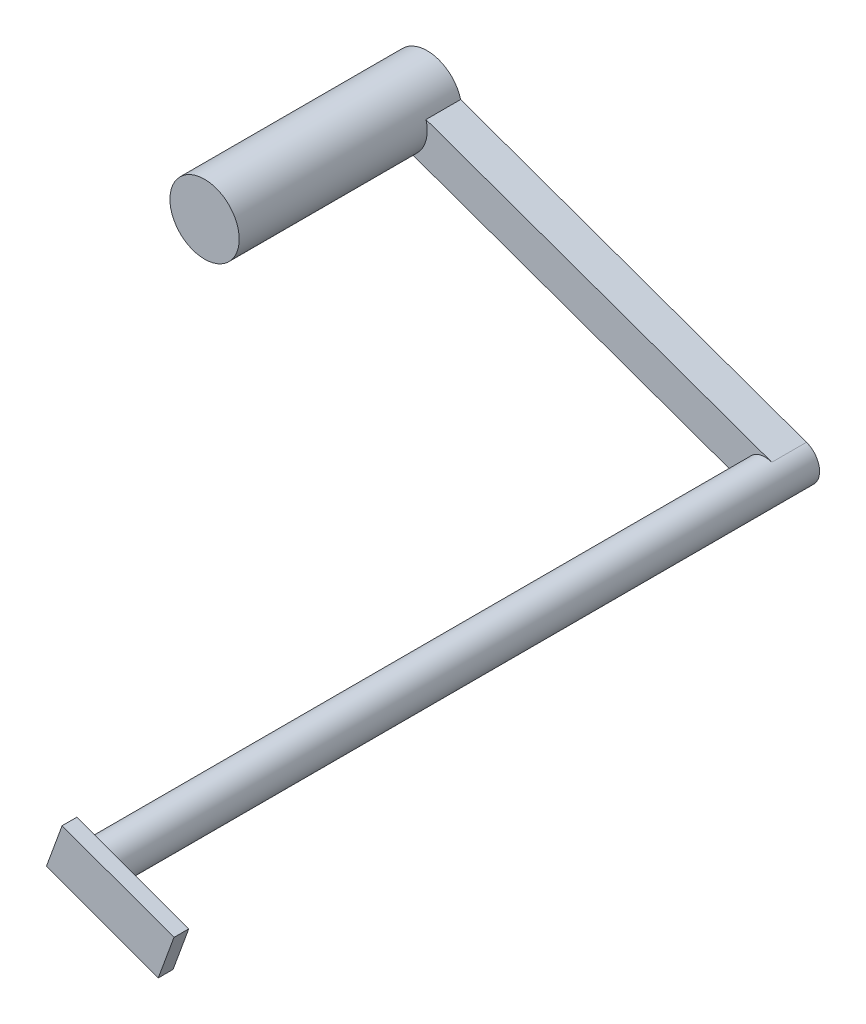
ISO-10303-21;
HEADER;
FILE_DESCRIPTION(('STEP AP214'),'2;1');
FILE_NAME('part.step','',(''),(''),'','','');
FILE_SCHEMA(('AUTOMOTIVE_DESIGN { 1 0 10303 214 1 1 1 1 }'));
ENDSEC;
DATA;
#1=APPLICATION_CONTEXT('core data for automotive mechanical design processes');
#2=APPLICATION_PROTOCOL_DEFINITION('international standard','automotive_design',2000,#1);
#3=PRODUCT_CONTEXT('',#1,'mechanical');
#4=PRODUCT('Part','Part','',(#3));
#5=PRODUCT_RELATED_PRODUCT_CATEGORY('part','',(#4));
#6=PRODUCT_DEFINITION_FORMATION('','',#4);
#7=PRODUCT_DEFINITION_CONTEXT('part definition',#1,'design');
#8=PRODUCT_DEFINITION('design','',#6,#7);
#9=PRODUCT_DEFINITION_SHAPE('','',#8);
#10=(LENGTH_UNIT() NAMED_UNIT(*) SI_UNIT(.MILLI.,.METRE.));
#11=(NAMED_UNIT(*) PLANE_ANGLE_UNIT() SI_UNIT($,.RADIAN.));
#12=(NAMED_UNIT(*) SI_UNIT($,.STERADIAN.) SOLID_ANGLE_UNIT());
#13=UNCERTAINTY_MEASURE_WITH_UNIT(LENGTH_MEASURE(1.E-05),#10,'distance_accuracy_value','');
#14=(GEOMETRIC_REPRESENTATION_CONTEXT(3) GLOBAL_UNCERTAINTY_ASSIGNED_CONTEXT((#13)) GLOBAL_UNIT_ASSIGNED_CONTEXT((#10,
#11,#12)) REPRESENTATION_CONTEXT('',''));
#15=CARTESIAN_POINT('',(0.,0.,0.));
#16=DIRECTION('',(0.,0.,1.));
#17=DIRECTION('',(1.,0.,0.));
#18=AXIS2_PLACEMENT_3D('',#15,#16,#17);
#19=CARTESIAN_POINT('',(-86.6066497970745,-63.7835303855215,45.));
#20=DIRECTION('',(0.,0.,-1.));
#21=DIRECTION('',(-1.,0.,0.));
#22=AXIS2_PLACEMENT_3D('',#19,#20,#21);
#23=CYLINDRICAL_SURFACE('',#22,7.);
#24=CARTESIAN_POINT('',(-86.6066497970745,-63.7835303855215,0.));
#25=DIRECTION('',(0.,0.,1.));
#26=DIRECTION('',(1.,0.,0.));
#27=AXIS2_PLACEMENT_3D('',#24,#25,#26);
#28=CIRCLE('',#27,7.);
#29=CARTESIAN_POINT('',(-79.8496648741146,-61.9551007995401,0.));
#30=VERTEX_POINT('',#29);
#31=CARTESIAN_POINT('',(-82.5475279582593,-69.4864708461657,0.));
#32=VERTEX_POINT('',#31);
#33=EDGE_CURVE('E160',#30,#32,#28,.T.);
#34=ORIENTED_EDGE('',*,*,#33,.T.);
#35=DIRECTION('',(0.,0.,-1.));
#36=VECTOR('',#35,1.);
#37=CARTESIAN_POINT('',(-82.5475279582593,-69.4864708461657,45.));
#38=LINE('',#37,#36);
#39=CARTESIAN_POINT('',(-82.5475279582593,-69.4864708461657,7.));
#40=VERTEX_POINT('',#39);
#41=EDGE_CURVE('E55',#32,#40,#38,.F.);
#42=ORIENTED_EDGE('',*,*,#41,.T.);
#43=CARTESIAN_POINT('',(-86.6066497970745,-63.7835303855215,7.));
#44=DIRECTION('',(0.,0.,-1.));
#45=DIRECTION('',(-1.,0.,0.));
#46=AXIS2_PLACEMENT_3D('',#43,#44,#45);
#47=CIRCLE('',#46,7.);
#48=CARTESIAN_POINT('',(-79.8496648741146,-61.9551007995401,7.));
#49=VERTEX_POINT('',#48);
#50=EDGE_CURVE('E11',#49,#40,#47,.T.);
#51=ORIENTED_EDGE('',*,*,#50,.F.);
#52=DIRECTION('',(0.,0.,-1.));
#53=VECTOR('',#52,1.);
#54=CARTESIAN_POINT('',(-79.8496648741146,-61.9551007995401,45.));
#55=LINE('',#54,#53);
#56=EDGE_CURVE('E155',#49,#30,#55,.T.);
#57=ORIENTED_EDGE('',*,*,#56,.T.);
#58=EDGE_LOOP('',(#34,#42,#51,#57));
#59=FACE_BOUND('',#58,.T.);
#60=CARTESIAN_POINT('',(-86.6066497970745,-63.7835303855215,45.));
#61=DIRECTION('',(0.,0.,1.));
#62=DIRECTION('',(1.,0.,0.));
#63=AXIS2_PLACEMENT_3D('',#60,#61,#62);
#64=CIRCLE('',#63,7.);
#65=CARTESIAN_POINT('',(-79.6066497970745,-63.7835303855215,45.));
#66=VERTEX_POINT('',#65);
#67=EDGE_CURVE('E48',#66,#66,#64,.T.);
#68=ORIENTED_EDGE('',*,*,#67,.F.);
#69=EDGE_LOOP('',(#68));
#70=FACE_BOUND('',#69,.T.);
#71=ADVANCED_FACE('F41',(#59,#70),#23,.T.);
#72=CARTESIAN_POINT('',(-86.6066497970745,-63.7835303855215,45.));
#73=DIRECTION('',(0.,0.,1.));
#74=DIRECTION('',(1.,0.,0.));
#75=AXIS2_PLACEMENT_3D('',#72,#73,#74);
#76=PLANE('',#75);
#77=ORIENTED_EDGE('',*,*,#67,.T.);
#78=EDGE_LOOP('',(#77));
#79=FACE_BOUND('',#78,.T.);
#80=ADVANCED_FACE('F190',(#79),#76,.T.);
#81=CARTESIAN_POINT('',(-86.6066497970745,-63.7835303855215,0.));
#82=DIRECTION('',(0.,0.,1.));
#83=DIRECTION('',(1.,0.,0.));
#84=AXIS2_PLACEMENT_3D('',#81,#82,#83);
#85=PLANE('',#84);
#86=ORIENTED_EDGE('',*,*,#33,.F.);
#87=DIRECTION('',(0.941421255828203,-0.337232885518078,0.));
#88=VECTOR('',#87,1.);
#89=CARTESIAN_POINT('',(-85.2577182550022,-60.0178453622087,0.));
#90=LINE('',#89,#88);
#91=CARTESIAN_POINT('',(-9.94401778874597,-86.9964762036549,0.));
#92=VERTEX_POINT('',#91);
#93=EDGE_CURVE('E137',#30,#92,#90,.T.);
#94=ORIENTED_EDGE('',*,*,#93,.T.);
#95=CARTESIAN_POINT('',(-11.2929493308183,-90.7621612269677,0.));
#96=DIRECTION('',(0.,0.,-1.));
#97=DIRECTION('',(-1.,0.,0.));
#98=AXIS2_PLACEMENT_3D('',#95,#96,#97);
#99=CIRCLE('',#98,4.00000000000002);
#100=CARTESIAN_POINT('',(-12.6418808728906,-94.5278462502806,0.));
#101=VERTEX_POINT('',#100);
#102=EDGE_CURVE('E148',#92,#101,#99,.T.);
#103=ORIENTED_EDGE('',*,*,#102,.T.);
#104=DIRECTION('',(-0.941421255828203,0.337232885518078,0.));
#105=VECTOR('',#104,1.);
#106=CARTESIAN_POINT('',(-87.9555813391469,-67.5492154088343,0.));
#107=LINE('',#106,#105);
#108=EDGE_CURVE('E143',#101,#32,#107,.T.);
#109=ORIENTED_EDGE('',*,*,#108,.T.);
#110=EDGE_LOOP('',(#86,#94,#103,#109));
#111=FACE_BOUND('',#110,.T.);
#112=ADVANCED_FACE('F169',(#111),#85,.F.);
#113=CARTESIAN_POINT('',(-87.9555813391469,-67.5492154088343,7.));
#114=DIRECTION('',(-0.337232885518078,-0.941421255828203,0.));
#115=DIRECTION('',(0.941421255828203,-0.337232885518078,0.));
#116=AXIS2_PLACEMENT_3D('',#113,#114,#115);
#117=PLANE('',#116);
#118=ORIENTED_EDGE('',*,*,#41,.F.);
#119=ORIENTED_EDGE('',*,*,#108,.F.);
#120=DIRECTION('',(0.,0.,-1.));
#121=VECTOR('',#120,1.);
#122=CARTESIAN_POINT('',(-12.6418808728906,-94.5278462502806,7.));
#123=LINE('',#122,#121);
#124=CARTESIAN_POINT('',(-12.6418808728906,-94.5278462502806,7.));
#125=VERTEX_POINT('',#124);
#126=EDGE_CURVE('E153',#125,#101,#123,.T.);
#127=ORIENTED_EDGE('',*,*,#126,.F.);
#128=DIRECTION('',(-0.941421255828203,0.337232885518078,0.));
#129=VECTOR('',#128,1.);
#130=CARTESIAN_POINT('',(-87.9555813391469,-67.5492154088343,7.));
#131=LINE('',#130,#129);
#132=EDGE_CURVE('E142',#125,#40,#131,.T.);
#133=ORIENTED_EDGE('',*,*,#132,.T.);
#134=EDGE_LOOP('',(#118,#119,#127,#133));
#135=FACE_BOUND('',#134,.T.);
#136=ADVANCED_FACE('F167',(#135),#117,.T.);
#137=CARTESIAN_POINT('',(-85.2577182550022,-60.0178453622087,7.));
#138=DIRECTION('',(0.337232885518078,0.941421255828203,0.));
#139=DIRECTION('',(-0.941421255828203,0.337232885518078,0.));
#140=AXIS2_PLACEMENT_3D('',#137,#138,#139);
#141=PLANE('',#140);
#142=ORIENTED_EDGE('',*,*,#56,.F.);
#143=DIRECTION('',(0.941421255828203,-0.337232885518078,0.));
#144=VECTOR('',#143,1.);
#145=CARTESIAN_POINT('',(-85.2577182550022,-60.0178453622087,7.));
#146=LINE('',#145,#144);
#147=CARTESIAN_POINT('',(-9.94401778874597,-86.9964762036549,7.));
#148=VERTEX_POINT('',#147);
#149=EDGE_CURVE('E139',#49,#148,#146,.T.);
#150=ORIENTED_EDGE('',*,*,#149,.T.);
#151=DIRECTION('',(0.,0.,-1.));
#152=VECTOR('',#151,1.);
#153=CARTESIAN_POINT('',(-9.94401778874597,-86.9964762036549,7.));
#154=LINE('',#153,#152);
#155=EDGE_CURVE('E146',#148,#92,#154,.T.);
#156=ORIENTED_EDGE('',*,*,#155,.T.);
#157=ORIENTED_EDGE('',*,*,#93,.F.);
#158=EDGE_LOOP('',(#142,#150,#156,#157));
#159=FACE_BOUND('',#158,.T.);
#160=ADVANCED_FACE('F179',(#159),#141,.T.);
#161=CARTESIAN_POINT('',(-11.2929493308183,-90.7621612269677,7.));
#162=DIRECTION('',(0.,0.,-1.));
#163=DIRECTION('',(-1.,0.,0.));
#164=AXIS2_PLACEMENT_3D('',#161,#162,#163);
#165=CYLINDRICAL_SURFACE('',#164,4.00000000000002);
#166=ORIENTED_EDGE('',*,*,#102,.F.);
#167=ORIENTED_EDGE('',*,*,#155,.F.);
#168=CARTESIAN_POINT('',(-11.2929493308183,-90.7621612269677,7.));
#169=DIRECTION('',(0.,0.,1.));
#170=DIRECTION('',(1.,0.,0.));
#171=AXIS2_PLACEMENT_3D('',#168,#169,#170);
#172=CIRCLE('',#171,4.00000000000002);
#173=EDGE_CURVE('E127',#148,#125,#172,.T.);
#174=ORIENTED_EDGE('',*,*,#173,.T.);
#175=ORIENTED_EDGE('',*,*,#126,.T.);
#176=EDGE_LOOP('',(#166,#167,#174,#175));
#177=FACE_BOUND('',#176,.T.);
#178=CARTESIAN_POINT('',(-11.2929493308183,-90.7621612269677,142.));
#179=DIRECTION('',(0.,0.,1.));
#180=DIRECTION('',(1.,0.,0.));
#181=AXIS2_PLACEMENT_3D('',#178,#179,#180);
#182=CIRCLE('',#181,4.00000000000002);
#183=CARTESIAN_POINT('',(-7.29294933081827,-90.7621612269677,142.));
#184=VERTEX_POINT('',#183);
#185=EDGE_CURVE('E130',#184,#184,#182,.T.);
#186=ORIENTED_EDGE('',*,*,#185,.F.);
#187=EDGE_LOOP('',(#186));
#188=FACE_BOUND('',#187,.T.);
#189=ADVANCED_FACE('F173',(#177,#188),#165,.T.);
#190=CARTESIAN_POINT('',(-86.6066497970745,-63.7835303855215,7.));
#191=DIRECTION('',(0.,0.,-1.));
#192=DIRECTION('',(-1.,0.,0.));
#193=AXIS2_PLACEMENT_3D('',#190,#191,#192);
#194=PLANE('',#193);
#195=ORIENTED_EDGE('',*,*,#173,.F.);
#196=ORIENTED_EDGE('',*,*,#149,.F.);
#197=ORIENTED_EDGE('',*,*,#50,.T.);
#198=ORIENTED_EDGE('',*,*,#132,.F.);
#199=EDGE_LOOP('',(#195,#196,#197,#198));
#200=FACE_BOUND('',#199,.T.);
#201=ADVANCED_FACE('F177',(#200),#194,.F.);
#202=CARTESIAN_POINT('',(-18.5707857495616,-93.0312257185735,145.));
#203=DIRECTION('',(0.939281053431866,-0.343148805424009,0.));
#204=DIRECTION('',(0.343148805424009,0.939281053431866,0.));
#205=AXIS2_PLACEMENT_3D('',#202,#203,#204);
#206=PLANE('',#205);
#207=DIRECTION('',(-0.343148805424009,-0.939281053431866,0.));
#208=VECTOR('',#207,1.);
#209=CARTESIAN_POINT('',(-18.5707857495616,-93.0312257185735,142.));
#210=LINE('',#209,#208);
#211=CARTESIAN_POINT('',(-15.3941404779379,-84.3359813524358,142.));
#212=VERTEX_POINT('',#211);
#213=CARTESIAN_POINT('',(-18.5707857495616,-93.0312257185735,142.));
#214=VERTEX_POINT('',#213);
#215=EDGE_CURVE('E126',#212,#214,#210,.T.);
#216=ORIENTED_EDGE('',*,*,#215,.T.);
#217=DIRECTION('',(0.,0.,-1.));
#218=VECTOR('',#217,1.);
#219=CARTESIAN_POINT('',(-18.5707857495616,-93.0312257185735,145.));
#220=LINE('',#219,#218);
#221=CARTESIAN_POINT('',(-18.5707857495616,-93.0312257185735,145.));
#222=VERTEX_POINT('',#221);
#223=EDGE_CURVE('E106',#222,#214,#220,.T.);
#224=ORIENTED_EDGE('',*,*,#223,.F.);
#225=DIRECTION('',(-0.343148805424009,-0.939281053431866,0.));
#226=VECTOR('',#225,1.);
#227=CARTESIAN_POINT('',(-18.5707857495616,-93.0312257185735,145.));
#228=LINE('',#227,#226);
#229=CARTESIAN_POINT('',(-15.3941404779379,-84.3359813524358,145.));
#230=VERTEX_POINT('',#229);
#231=EDGE_CURVE('E113',#230,#222,#228,.T.);
#232=ORIENTED_EDGE('',*,*,#231,.F.);
#233=DIRECTION('',(0.,0.,-1.));
#234=VECTOR('',#233,1.);
#235=CARTESIAN_POINT('',(-15.3941404779379,-84.3359813524358,145.));
#236=LINE('',#235,#234);
#237=EDGE_CURVE('E299',#230,#212,#236,.T.);
#238=ORIENTED_EDGE('',*,*,#237,.T.);
#239=EDGE_LOOP('',(#216,#224,#232,#238));
#240=FACE_BOUND('',#239,.T.);
#241=ADVANCED_FACE('F124',(#240),#206,.F.);
#242=CARTESIAN_POINT('',(4.0309321808732,-101.288341605263,145.));
#243=DIRECTION('',(0.343148805424009,0.939281053431866,0.));
#244=DIRECTION('',(-0.939281053431866,0.343148805424009,0.));
#245=AXIS2_PLACEMENT_3D('',#242,#243,#244);
#246=PLANE('',#245);
#247=DIRECTION('',(0.939281053431866,-0.343148805424009,0.));
#248=VECTOR('',#247,1.);
#249=CARTESIAN_POINT('',(4.0309321808732,-101.288341605263,142.));
#250=LINE('',#249,#248);
#251=CARTESIAN_POINT('',(4.0309321808732,-101.288341605263,142.));
#252=VERTEX_POINT('',#251);
#253=EDGE_CURVE('E290',#214,#252,#250,.T.);
#254=ORIENTED_EDGE('',*,*,#253,.T.);
#255=DIRECTION('',(0.,0.,-1.));
#256=VECTOR('',#255,1.);
#257=CARTESIAN_POINT('',(4.0309321808732,-101.288341605263,145.));
#258=LINE('',#257,#256);
#259=CARTESIAN_POINT('',(4.0309321808732,-101.288341605263,145.));
#260=VERTEX_POINT('',#259);
#261=EDGE_CURVE('E109',#260,#252,#258,.T.);
#262=ORIENTED_EDGE('',*,*,#261,.F.);
#263=DIRECTION('',(0.939281053431866,-0.343148805424009,0.));
#264=VECTOR('',#263,1.);
#265=CARTESIAN_POINT('',(4.0309321808732,-101.288341605263,145.));
#266=LINE('',#265,#264);
#267=EDGE_CURVE('E102',#222,#260,#266,.T.);
#268=ORIENTED_EDGE('',*,*,#267,.F.);
#269=ORIENTED_EDGE('',*,*,#223,.T.);
#270=EDGE_LOOP('',(#254,#262,#268,#269));
#271=FACE_BOUND('',#270,.T.);
#272=ADVANCED_FACE('F104',(#271),#246,.F.);
#273=CARTESIAN_POINT('',(7.20757745249683,-92.5930972391257,145.));
#274=DIRECTION('',(-0.939281053431866,0.34314880542401,0.));
#275=DIRECTION('',(-0.34314880542401,-0.939281053431866,0.));
#276=AXIS2_PLACEMENT_3D('',#273,#274,#275);
#277=PLANE('',#276);
#278=DIRECTION('',(0.34314880542401,0.939281053431866,0.));
#279=VECTOR('',#278,1.);
#280=CARTESIAN_POINT('',(7.20757745249683,-92.5930972391257,142.));
#281=LINE('',#280,#279);
#282=CARTESIAN_POINT('',(7.20757745249683,-92.5930972391257,142.));
#283=VERTEX_POINT('',#282);
#284=EDGE_CURVE('E292',#252,#283,#281,.T.);
#285=ORIENTED_EDGE('',*,*,#284,.T.);
#286=DIRECTION('',(0.,0.,-1.));
#287=VECTOR('',#286,1.);
#288=CARTESIAN_POINT('',(7.20757745249683,-92.5930972391257,145.));
#289=LINE('',#288,#287);
#290=CARTESIAN_POINT('',(7.20757745249683,-92.5930972391257,145.));
#291=VERTEX_POINT('',#290);
#292=EDGE_CURVE('E132',#291,#283,#289,.T.);
#293=ORIENTED_EDGE('',*,*,#292,.F.);
#294=DIRECTION('',(0.34314880542401,0.939281053431866,0.));
#295=VECTOR('',#294,1.);
#296=CARTESIAN_POINT('',(7.20757745249683,-92.5930972391257,145.));
#297=LINE('',#296,#295);
#298=EDGE_CURVE('E112',#260,#291,#297,.T.);
#299=ORIENTED_EDGE('',*,*,#298,.F.);
#300=ORIENTED_EDGE('',*,*,#261,.T.);
#301=EDGE_LOOP('',(#285,#293,#299,#300));
#302=FACE_BOUND('',#301,.T.);
#303=ADVANCED_FACE('F243',(#302),#277,.F.);
#304=CARTESIAN_POINT('',(-15.3941404779379,-84.3359813524358,145.));
#305=DIRECTION('',(-0.34314880542401,-0.939281053431865,0.));
#306=DIRECTION('',(0.939281053431865,-0.34314880542401,0.));
#307=AXIS2_PLACEMENT_3D('',#304,#305,#306);
#308=PLANE('',#307);
#309=DIRECTION('',(-0.939281053431865,0.34314880542401,0.));
#310=VECTOR('',#309,1.);
#311=CARTESIAN_POINT('',(-15.3941404779379,-84.3359813524358,142.));
#312=LINE('',#311,#310);
#313=EDGE_CURVE('E122',#283,#212,#312,.T.);
#314=ORIENTED_EDGE('',*,*,#313,.T.);
#315=ORIENTED_EDGE('',*,*,#237,.F.);
#316=DIRECTION('',(-0.939281053431865,0.34314880542401,0.));
#317=VECTOR('',#316,1.);
#318=CARTESIAN_POINT('',(-15.3941404779379,-84.3359813524358,145.));
#319=LINE('',#318,#317);
#320=EDGE_CURVE('E118',#291,#230,#319,.T.);
#321=ORIENTED_EDGE('',*,*,#320,.F.);
#322=ORIENTED_EDGE('',*,*,#292,.T.);
#323=EDGE_LOOP('',(#314,#315,#321,#322));
#324=FACE_BOUND('',#323,.T.);
#325=ADVANCED_FACE('F251',(#324),#308,.F.);
#326=CARTESIAN_POINT('',(0.,0.,145.));
#327=DIRECTION('',(0.,0.,-1.));
#328=DIRECTION('',(-1.,0.,0.));
#329=AXIS2_PLACEMENT_3D('',#326,#327,#328);
#330=PLANE('',#329);
#331=ORIENTED_EDGE('',*,*,#231,.T.);
#332=ORIENTED_EDGE('',*,*,#267,.T.);
#333=ORIENTED_EDGE('',*,*,#298,.T.);
#334=ORIENTED_EDGE('',*,*,#320,.T.);
#335=EDGE_LOOP('',(#331,#332,#333,#334));
#336=FACE_BOUND('',#335,.T.);
#337=ADVANCED_FACE('F116',(#336),#330,.F.);
#338=CARTESIAN_POINT('',(0.,0.,142.));
#339=DIRECTION('',(0.,0.,-1.));
#340=DIRECTION('',(-1.,0.,0.));
#341=AXIS2_PLACEMENT_3D('',#338,#339,#340);
#342=PLANE('',#341);
#343=ORIENTED_EDGE('',*,*,#185,.T.);
#344=EDGE_LOOP('',(#343));
#345=FACE_BOUND('',#344,.T.);
#346=ORIENTED_EDGE('',*,*,#215,.F.);
#347=ORIENTED_EDGE('',*,*,#313,.F.);
#348=ORIENTED_EDGE('',*,*,#284,.F.);
#349=ORIENTED_EDGE('',*,*,#253,.F.);
#350=EDGE_LOOP('',(#346,#347,#348,#349));
#351=FACE_BOUND('',#350,.T.);
#352=ADVANCED_FACE('F268',(#345,#351),#342,.T.);
#353=CLOSED_SHELL('',(#71,#80,#112,#136,#160,#189,#201,#241,#272,#303,#325,#337,#352));
#354=MANIFOLD_SOLID_BREP('B2',#353);
#355=ADVANCED_BREP_SHAPE_REPRESENTATION('',(#18,#354),#14);
#356=SHAPE_DEFINITION_REPRESENTATION(#9,#355);
ENDSEC;
END-ISO-10303-21;
